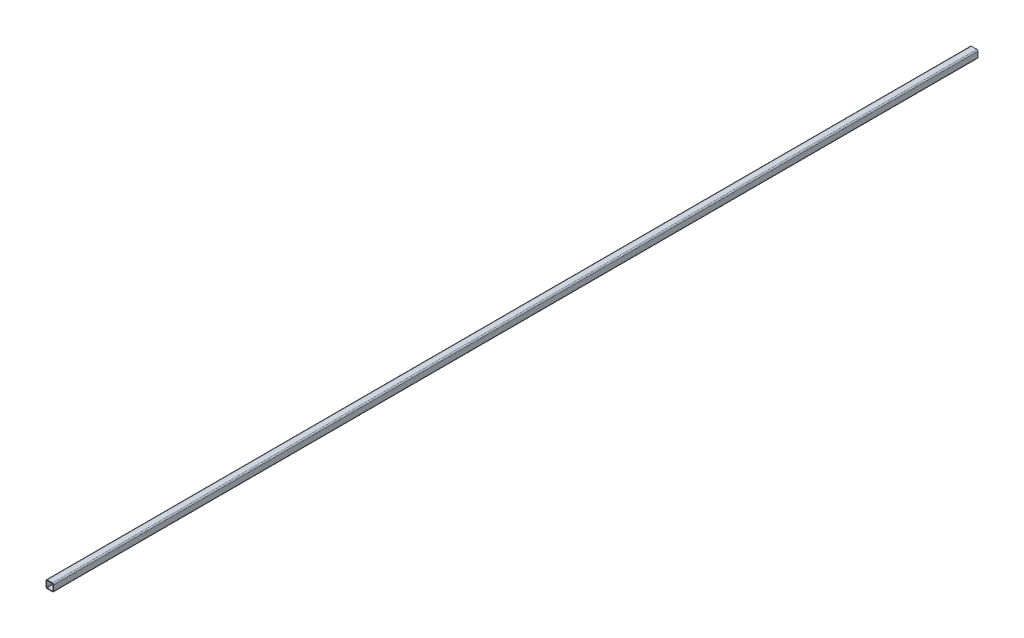
ISO-10303-21;
HEADER;
FILE_DESCRIPTION(('STEP AP214'),'2;1');
FILE_NAME('part.step','',(''),(''),'','','');
FILE_SCHEMA(('AUTOMOTIVE_DESIGN { 1 0 10303 214 1 1 1 1 }'));
ENDSEC;
DATA;
#1=APPLICATION_CONTEXT('core data for automotive mechanical design processes');
#2=APPLICATION_PROTOCOL_DEFINITION('international standard','automotive_design',2000,#1);
#3=PRODUCT_CONTEXT('',#1,'mechanical');
#4=PRODUCT('Part','Part','',(#3));
#5=PRODUCT_RELATED_PRODUCT_CATEGORY('part','',(#4));
#6=PRODUCT_DEFINITION_FORMATION('','',#4);
#7=PRODUCT_DEFINITION_CONTEXT('part definition',#1,'design');
#8=PRODUCT_DEFINITION('design','',#6,#7);
#9=PRODUCT_DEFINITION_SHAPE('','',#8);
#10=(LENGTH_UNIT() NAMED_UNIT(*) SI_UNIT(.MILLI.,.METRE.));
#11=(NAMED_UNIT(*) PLANE_ANGLE_UNIT() SI_UNIT($,.RADIAN.));
#12=(NAMED_UNIT(*) SI_UNIT($,.STERADIAN.) SOLID_ANGLE_UNIT());
#13=UNCERTAINTY_MEASURE_WITH_UNIT(LENGTH_MEASURE(1.E-05),#10,'distance_accuracy_value','');
#14=(GEOMETRIC_REPRESENTATION_CONTEXT(3) GLOBAL_UNCERTAINTY_ASSIGNED_CONTEXT((#13)) GLOBAL_UNIT_ASSIGNED_CONTEXT((#10,
#11,#12)) REPRESENTATION_CONTEXT('',''));
#15=CARTESIAN_POINT('',(0.,0.,0.));
#16=DIRECTION('',(0.,0.,1.));
#17=DIRECTION('',(1.,0.,0.));
#18=AXIS2_PLACEMENT_3D('',#15,#16,#17);
#19=CARTESIAN_POINT('',(0.999999329581613,-8.70000000652501,1524.));
#20=DIRECTION('',(0.,0.,1.));
#21=DIRECTION('',(1.,0.,0.));
#22=AXIS2_PLACEMENT_3D('',#19,#20,#21);
#23=PLANE('',#22);
#24=CARTESIAN_POINT('',(0.999999329581613,-8.70000000652501,1524.));
#25=DIRECTION('',(0.,0.,1.));
#26=DIRECTION('',(1.,0.,0.));
#27=AXIS2_PLACEMENT_3D('',#24,#25,#26);
#28=CIRCLE('',#27,2.);
#29=CARTESIAN_POINT('',(-1.00000067041839,-8.70000000652501,1524.));
#30=VERTEX_POINT('',#29);
#31=CARTESIAN_POINT('',(0.999999329581614,-10.700000006525,1524.));
#32=VERTEX_POINT('',#31);
#33=EDGE_CURVE('E282',#30,#32,#28,.T.);
#34=ORIENTED_EDGE('',*,*,#33,.T.);
#35=DIRECTION('',(1.,0.,0.));
#36=VECTOR('',#35,1.);
#37=CARTESIAN_POINT('',(0.999999329581614,-10.700000006525,1524.));
#38=LINE('',#37,#36);
#39=CARTESIAN_POINT('',(9.69999932958162,-10.700000006525,1524.));
#40=VERTEX_POINT('',#39);
#41=EDGE_CURVE('E286',#32,#40,#38,.T.);
#42=ORIENTED_EDGE('',*,*,#41,.T.);
#43=CARTESIAN_POINT('',(9.69999932958162,-8.700000006525,1524.));
#44=DIRECTION('',(0.,0.,1.));
#45=DIRECTION('',(1.,0.,0.));
#46=AXIS2_PLACEMENT_3D('',#43,#44,#45);
#47=CIRCLE('',#46,2.);
#48=CARTESIAN_POINT('',(11.6999993295816,-8.700000006525,1524.));
#49=VERTEX_POINT('',#48);
#50=EDGE_CURVE('E290',#40,#49,#47,.T.);
#51=ORIENTED_EDGE('',*,*,#50,.T.);
#52=DIRECTION('',(0.,1.,0.));
#53=VECTOR('',#52,1.);
#54=CARTESIAN_POINT('',(11.6999993295816,0.,1524.));
#55=LINE('',#54,#53);
#56=CARTESIAN_POINT('',(11.6999993295816,0.,1524.));
#57=VERTEX_POINT('',#56);
#58=EDGE_CURVE('E293',#49,#57,#55,.T.);
#59=ORIENTED_EDGE('',*,*,#58,.T.);
#60=CARTESIAN_POINT('',(9.69999932958161,0.,1524.));
#61=DIRECTION('',(0.,0.,1.));
#62=DIRECTION('',(1.,0.,0.));
#63=AXIS2_PLACEMENT_3D('',#60,#61,#62);
#64=CIRCLE('',#63,2.);
#65=CARTESIAN_POINT('',(9.69999932958161,2.,1524.));
#66=VERTEX_POINT('',#65);
#67=EDGE_CURVE('E296',#57,#66,#64,.T.);
#68=ORIENTED_EDGE('',*,*,#67,.T.);
#69=DIRECTION('',(-1.,0.,0.));
#70=VECTOR('',#69,1.);
#71=CARTESIAN_POINT('',(0.999999329581612,1.99999999999999,1524.));
#72=LINE('',#71,#70);
#73=CARTESIAN_POINT('',(0.999999329581612,1.99999999999999,1524.));
#74=VERTEX_POINT('',#73);
#75=EDGE_CURVE('E299',#66,#74,#72,.T.);
#76=ORIENTED_EDGE('',*,*,#75,.T.);
#77=CARTESIAN_POINT('',(0.999999329581613,0.,1524.));
#78=DIRECTION('',(0.,0.,1.));
#79=DIRECTION('',(1.,0.,0.));
#80=AXIS2_PLACEMENT_3D('',#77,#78,#79);
#81=CIRCLE('',#80,2.);
#82=CARTESIAN_POINT('',(-1.00000067041839,0.,1524.));
#83=VERTEX_POINT('',#82);
#84=EDGE_CURVE('E302',#74,#83,#81,.T.);
#85=ORIENTED_EDGE('',*,*,#84,.T.);
#86=DIRECTION('',(0.,-1.,0.));
#87=VECTOR('',#86,1.);
#88=CARTESIAN_POINT('',(-1.00000067041839,0.,1524.));
#89=LINE('',#88,#87);
#90=EDGE_CURVE('E305',#83,#30,#89,.T.);
#91=ORIENTED_EDGE('',*,*,#90,.T.);
#92=EDGE_LOOP('',(#34,#42,#51,#59,#68,#76,#85,#91));
#93=FACE_BOUND('',#92,.T.);
#94=DIRECTION('',(0.,-1.,0.));
#95=VECTOR('',#94,1.);
#96=CARTESIAN_POINT('',(0.,0.,1524.));
#97=LINE('',#96,#95);
#98=CARTESIAN_POINT('',(0.,0.,1524.));
#99=VERTEX_POINT('',#98);
#100=CARTESIAN_POINT('',(0.,-8.70000000652501,1524.));
#101=VERTEX_POINT('',#100);
#102=EDGE_CURVE('E201',#99,#101,#97,.T.);
#103=ORIENTED_EDGE('',*,*,#102,.F.);
#104=CARTESIAN_POINT('',(1.,0.,1524.));
#105=DIRECTION('',(0.,0.,1.));
#106=DIRECTION('',(1.,0.,0.));
#107=AXIS2_PLACEMENT_3D('',#104,#105,#106);
#108=CIRCLE('',#107,1.);
#109=CARTESIAN_POINT('',(1.,1.,1524.));
#110=VERTEX_POINT('',#109);
#111=EDGE_CURVE('E192',#110,#99,#108,.T.);
#112=ORIENTED_EDGE('',*,*,#111,.F.);
#113=DIRECTION('',(-1.,0.,0.));
#114=VECTOR('',#113,1.);
#115=CARTESIAN_POINT('',(9.69999932958162,1.,1524.));
#116=LINE('',#115,#114);
#117=CARTESIAN_POINT('',(9.69999932958162,1.,1524.));
#118=VERTEX_POINT('',#117);
#119=EDGE_CURVE('E234',#118,#110,#116,.T.);
#120=ORIENTED_EDGE('',*,*,#119,.F.);
#121=CARTESIAN_POINT('',(9.69999932958162,0.,1524.));
#122=DIRECTION('',(0.,0.,1.));
#123=DIRECTION('',(1.,0.,0.));
#124=AXIS2_PLACEMENT_3D('',#121,#122,#123);
#125=CIRCLE('',#124,1.);
#126=CARTESIAN_POINT('',(10.6999993295816,0.,1524.));
#127=VERTEX_POINT('',#126);
#128=EDGE_CURVE('E231',#127,#118,#125,.T.);
#129=ORIENTED_EDGE('',*,*,#128,.F.);
#130=DIRECTION('',(0.,1.,0.));
#131=VECTOR('',#130,1.);
#132=CARTESIAN_POINT('',(10.6999993295816,0.,1524.));
#133=LINE('',#132,#131);
#134=CARTESIAN_POINT('',(10.6999993295816,-8.70000000652501,1524.));
#135=VERTEX_POINT('',#134);
#136=EDGE_CURVE('E228',#135,#127,#133,.T.);
#137=ORIENTED_EDGE('',*,*,#136,.F.);
#138=CARTESIAN_POINT('',(9.69999932958162,-8.70000000652501,1524.));
#139=DIRECTION('',(0.,0.,1.));
#140=DIRECTION('',(1.,0.,0.));
#141=AXIS2_PLACEMENT_3D('',#138,#139,#140);
#142=CIRCLE('',#141,1.);
#143=CARTESIAN_POINT('',(9.69999932958162,-9.70000000652501,1524.));
#144=VERTEX_POINT('',#143);
#145=EDGE_CURVE('E225',#144,#135,#142,.T.);
#146=ORIENTED_EDGE('',*,*,#145,.F.);
#147=DIRECTION('',(1.,0.,0.));
#148=VECTOR('',#147,1.);
#149=CARTESIAN_POINT('',(9.69999932958162,-9.70000000652501,1524.));
#150=LINE('',#149,#148);
#151=CARTESIAN_POINT('',(1.,-9.70000000652501,1524.));
#152=VERTEX_POINT('',#151);
#153=EDGE_CURVE('E220',#152,#144,#150,.T.);
#154=ORIENTED_EDGE('',*,*,#153,.F.);
#155=CARTESIAN_POINT('',(1.,-8.70000000652501,1524.));
#156=DIRECTION('',(0.,0.,1.));
#157=DIRECTION('',(1.,0.,0.));
#158=AXIS2_PLACEMENT_3D('',#155,#156,#157);
#159=CIRCLE('',#158,1.);
#160=EDGE_CURVE('E215',#101,#152,#159,.T.);
#161=ORIENTED_EDGE('',*,*,#160,.F.);
#162=EDGE_LOOP('',(#103,#112,#120,#129,#137,#146,#154,#161));
#163=FACE_BOUND('',#162,.T.);
#164=ADVANCED_FACE('F46',(#93,#163),#23,.T.);
#165=CARTESIAN_POINT('',(0.999999329581613,-8.70000000652501,0.));
#166=DIRECTION('',(0.,0.,1.));
#167=DIRECTION('',(1.,0.,0.));
#168=AXIS2_PLACEMENT_3D('',#165,#166,#167);
#169=PLANE('',#168);
#170=CARTESIAN_POINT('',(0.999999329581613,-8.70000000652501,0.));
#171=DIRECTION('',(0.,0.,1.));
#172=DIRECTION('',(1.,0.,0.));
#173=AXIS2_PLACEMENT_3D('',#170,#171,#172);
#174=CIRCLE('',#173,2.);
#175=CARTESIAN_POINT('',(-1.00000067041839,-8.70000000652501,0.));
#176=VERTEX_POINT('',#175);
#177=CARTESIAN_POINT('',(0.999999329581614,-10.700000006525,0.));
#178=VERTEX_POINT('',#177);
#179=EDGE_CURVE('E210',#176,#178,#174,.T.);
#180=ORIENTED_EDGE('',*,*,#179,.F.);
#181=DIRECTION('',(0.,-1.,0.));
#182=VECTOR('',#181,1.);
#183=CARTESIAN_POINT('',(-1.00000067041839,0.,0.));
#184=LINE('',#183,#182);
#185=CARTESIAN_POINT('',(-1.00000067041839,0.,0.));
#186=VERTEX_POINT('',#185);
#187=EDGE_CURVE('E287',#186,#176,#184,.T.);
#188=ORIENTED_EDGE('',*,*,#187,.F.);
#189=CARTESIAN_POINT('',(0.999999329581613,0.,0.));
#190=DIRECTION('',(0.,0.,1.));
#191=DIRECTION('',(1.,0.,0.));
#192=AXIS2_PLACEMENT_3D('',#189,#190,#191);
#193=CIRCLE('',#192,2.);
#194=CARTESIAN_POINT('',(0.999999329581612,1.99999999999999,0.));
#195=VERTEX_POINT('',#194);
#196=EDGE_CURVE('E326',#195,#186,#193,.T.);
#197=ORIENTED_EDGE('',*,*,#196,.F.);
#198=DIRECTION('',(-1.,0.,0.));
#199=VECTOR('',#198,1.);
#200=CARTESIAN_POINT('',(0.999999329581612,1.99999999999999,0.));
#201=LINE('',#200,#199);
#202=CARTESIAN_POINT('',(9.69999932958161,2.,0.));
#203=VERTEX_POINT('',#202);
#204=EDGE_CURVE('E323',#203,#195,#201,.T.);
#205=ORIENTED_EDGE('',*,*,#204,.F.);
#206=CARTESIAN_POINT('',(9.69999932958161,0.,0.));
#207=DIRECTION('',(0.,0.,1.));
#208=DIRECTION('',(1.,0.,0.));
#209=AXIS2_PLACEMENT_3D('',#206,#207,#208);
#210=CIRCLE('',#209,2.);
#211=CARTESIAN_POINT('',(11.6999993295816,0.,0.));
#212=VERTEX_POINT('',#211);
#213=EDGE_CURVE('E320',#212,#203,#210,.T.);
#214=ORIENTED_EDGE('',*,*,#213,.F.);
#215=DIRECTION('',(0.,1.,0.));
#216=VECTOR('',#215,1.);
#217=CARTESIAN_POINT('',(11.6999993295816,0.,0.));
#218=LINE('',#217,#216);
#219=CARTESIAN_POINT('',(11.6999993295816,-8.700000006525,0.));
#220=VERTEX_POINT('',#219);
#221=EDGE_CURVE('E317',#220,#212,#218,.T.);
#222=ORIENTED_EDGE('',*,*,#221,.F.);
#223=CARTESIAN_POINT('',(9.69999932958162,-8.700000006525,0.));
#224=DIRECTION('',(0.,0.,1.));
#225=DIRECTION('',(1.,0.,0.));
#226=AXIS2_PLACEMENT_3D('',#223,#224,#225);
#227=CIRCLE('',#226,2.);
#228=CARTESIAN_POINT('',(9.69999932958162,-10.700000006525,0.));
#229=VERTEX_POINT('',#228);
#230=EDGE_CURVE('E314',#229,#220,#227,.T.);
#231=ORIENTED_EDGE('',*,*,#230,.F.);
#232=DIRECTION('',(1.,0.,0.));
#233=VECTOR('',#232,1.);
#234=CARTESIAN_POINT('',(0.999999329581614,-10.700000006525,0.));
#235=LINE('',#234,#233);
#236=EDGE_CURVE('E311',#178,#229,#235,.T.);
#237=ORIENTED_EDGE('',*,*,#236,.F.);
#238=EDGE_LOOP('',(#180,#188,#197,#205,#214,#222,#231,#237));
#239=FACE_BOUND('',#238,.T.);
#240=CARTESIAN_POINT('',(1.,0.,0.));
#241=DIRECTION('',(0.,0.,1.));
#242=DIRECTION('',(1.,0.,0.));
#243=AXIS2_PLACEMENT_3D('',#240,#241,#242);
#244=CIRCLE('',#243,1.);
#245=CARTESIAN_POINT('',(1.,0.999999999999999,0.));
#246=VERTEX_POINT('',#245);
#247=CARTESIAN_POINT('',(0.,0.,0.));
#248=VERTEX_POINT('',#247);
#249=EDGE_CURVE('E76',#246,#248,#244,.T.);
#250=ORIENTED_EDGE('',*,*,#249,.T.);
#251=DIRECTION('',(0.,-1.,0.));
#252=VECTOR('',#251,1.);
#253=CARTESIAN_POINT('',(0.,0.,0.));
#254=LINE('',#253,#252);
#255=CARTESIAN_POINT('',(0.,-8.70000000652501,0.));
#256=VERTEX_POINT('',#255);
#257=EDGE_CURVE('E208',#248,#256,#254,.T.);
#258=ORIENTED_EDGE('',*,*,#257,.T.);
#259=CARTESIAN_POINT('',(1.,-8.70000000652501,0.));
#260=DIRECTION('',(0.,0.,1.));
#261=DIRECTION('',(1.,0.,0.));
#262=AXIS2_PLACEMENT_3D('',#259,#260,#261);
#263=CIRCLE('',#262,1.);
#264=CARTESIAN_POINT('',(1.,-9.70000000652501,0.));
#265=VERTEX_POINT('',#264);
#266=EDGE_CURVE('E241',#256,#265,#263,.T.);
#267=ORIENTED_EDGE('',*,*,#266,.T.);
#268=DIRECTION('',(1.,0.,0.));
#269=VECTOR('',#268,1.);
#270=CARTESIAN_POINT('',(9.69999932958162,-9.70000000652501,0.));
#271=LINE('',#270,#269);
#272=CARTESIAN_POINT('',(9.69999932958162,-9.70000000652501,0.));
#273=VERTEX_POINT('',#272);
#274=EDGE_CURVE('E245',#265,#273,#271,.T.);
#275=ORIENTED_EDGE('',*,*,#274,.T.);
#276=CARTESIAN_POINT('',(9.69999932958162,-8.70000000652501,0.));
#277=DIRECTION('',(0.,0.,1.));
#278=DIRECTION('',(1.,0.,0.));
#279=AXIS2_PLACEMENT_3D('',#276,#277,#278);
#280=CIRCLE('',#279,1.);
#281=CARTESIAN_POINT('',(10.6999993295816,-8.70000000652501,0.));
#282=VERTEX_POINT('',#281);
#283=EDGE_CURVE('E249',#273,#282,#280,.T.);
#284=ORIENTED_EDGE('',*,*,#283,.T.);
#285=DIRECTION('',(0.,1.,0.));
#286=VECTOR('',#285,1.);
#287=CARTESIAN_POINT('',(10.6999993295816,0.,0.));
#288=LINE('',#287,#286);
#289=CARTESIAN_POINT('',(10.6999993295816,0.,0.));
#290=VERTEX_POINT('',#289);
#291=EDGE_CURVE('E253',#282,#290,#288,.T.);
#292=ORIENTED_EDGE('',*,*,#291,.T.);
#293=CARTESIAN_POINT('',(9.69999932958162,0.,0.));
#294=DIRECTION('',(0.,0.,1.));
#295=DIRECTION('',(1.,0.,0.));
#296=AXIS2_PLACEMENT_3D('',#293,#294,#295);
#297=CIRCLE('',#296,1.);
#298=CARTESIAN_POINT('',(9.69999932958162,1.,0.));
#299=VERTEX_POINT('',#298);
#300=EDGE_CURVE('E257',#290,#299,#297,.T.);
#301=ORIENTED_EDGE('',*,*,#300,.T.);
#302=DIRECTION('',(-1.,0.,0.));
#303=VECTOR('',#302,1.);
#304=CARTESIAN_POINT('',(9.69999932958162,1.,0.));
#305=LINE('',#304,#303);
#306=EDGE_CURVE('E202',#299,#246,#305,.T.);
#307=ORIENTED_EDGE('',*,*,#306,.T.);
#308=EDGE_LOOP('',(#250,#258,#267,#275,#284,#292,#301,#307));
#309=FACE_BOUND('',#308,.T.);
#310=ADVANCED_FACE('F365',(#239,#309),#169,.F.);
#311=CARTESIAN_POINT('',(0.999999329581613,-8.70000000652501,1524.));
#312=DIRECTION('',(0.,0.,-1.));
#313=DIRECTION('',(-1.,0.,0.));
#314=AXIS2_PLACEMENT_3D('',#311,#312,#313);
#315=CYLINDRICAL_SURFACE('',#314,2.);
#316=ORIENTED_EDGE('',*,*,#179,.T.);
#317=DIRECTION('',(0.,0.,-1.));
#318=VECTOR('',#317,1.);
#319=CARTESIAN_POINT('',(0.999999329581614,-10.700000006525,1524.));
#320=LINE('',#319,#318);
#321=EDGE_CURVE('E11',#32,#178,#320,.T.);
#322=ORIENTED_EDGE('',*,*,#321,.F.);
#323=ORIENTED_EDGE('',*,*,#33,.F.);
#324=DIRECTION('',(0.,0.,-1.));
#325=VECTOR('',#324,1.);
#326=CARTESIAN_POINT('',(-1.00000067041839,-8.70000000652501,1524.));
#327=LINE('',#326,#325);
#328=EDGE_CURVE('E307',#30,#176,#327,.T.);
#329=ORIENTED_EDGE('',*,*,#328,.T.);
#330=EDGE_LOOP('',(#316,#322,#323,#329));
#331=FACE_BOUND('',#330,.T.);
#332=ADVANCED_FACE('F48',(#331),#315,.T.);
#333=CARTESIAN_POINT('',(0.999999329581614,-10.700000006525,1524.));
#334=DIRECTION('',(0.,1.,0.));
#335=DIRECTION('',(0.,0.,1.));
#336=AXIS2_PLACEMENT_3D('',#333,#334,#335);
#337=PLANE('',#336);
#338=ORIENTED_EDGE('',*,*,#236,.T.);
#339=DIRECTION('',(0.,0.,-1.));
#340=VECTOR('',#339,1.);
#341=CARTESIAN_POINT('',(9.69999932958162,-10.700000006525,1524.));
#342=LINE('',#341,#340);
#343=EDGE_CURVE('E55',#40,#229,#342,.T.);
#344=ORIENTED_EDGE('',*,*,#343,.F.);
#345=ORIENTED_EDGE('',*,*,#41,.F.);
#346=ORIENTED_EDGE('',*,*,#321,.T.);
#347=EDGE_LOOP('',(#338,#344,#345,#346));
#348=FACE_BOUND('',#347,.T.);
#349=ADVANCED_FACE('F382',(#348),#337,.F.);
#350=CARTESIAN_POINT('',(9.69999932958162,-8.700000006525,1524.));
#351=DIRECTION('',(0.,0.,-1.));
#352=DIRECTION('',(-1.,0.,0.));
#353=AXIS2_PLACEMENT_3D('',#350,#351,#352);
#354=CYLINDRICAL_SURFACE('',#353,2.);
#355=ORIENTED_EDGE('',*,*,#230,.T.);
#356=DIRECTION('',(0.,0.,-1.));
#357=VECTOR('',#356,1.);
#358=CARTESIAN_POINT('',(11.6999993295816,-8.700000006525,1524.));
#359=LINE('',#358,#357);
#360=EDGE_CURVE('E350',#49,#220,#359,.T.);
#361=ORIENTED_EDGE('',*,*,#360,.F.);
#362=ORIENTED_EDGE('',*,*,#50,.F.);
#363=ORIENTED_EDGE('',*,*,#343,.T.);
#364=EDGE_LOOP('',(#355,#361,#362,#363));
#365=FACE_BOUND('',#364,.T.);
#366=ADVANCED_FACE('F359',(#365),#354,.T.);
#367=CARTESIAN_POINT('',(11.6999993295816,0.,1524.));
#368=DIRECTION('',(-1.,0.,0.));
#369=DIRECTION('',(0.,-1.,0.));
#370=AXIS2_PLACEMENT_3D('',#367,#368,#369);
#371=PLANE('',#370);
#372=ORIENTED_EDGE('',*,*,#221,.T.);
#373=DIRECTION('',(0.,0.,-1.));
#374=VECTOR('',#373,1.);
#375=CARTESIAN_POINT('',(11.6999993295816,0.,1524.));
#376=LINE('',#375,#374);
#377=EDGE_CURVE('E346',#57,#212,#376,.T.);
#378=ORIENTED_EDGE('',*,*,#377,.F.);
#379=ORIENTED_EDGE('',*,*,#58,.F.);
#380=ORIENTED_EDGE('',*,*,#360,.T.);
#381=EDGE_LOOP('',(#372,#378,#379,#380));
#382=FACE_BOUND('',#381,.T.);
#383=ADVANCED_FACE('F371',(#382),#371,.F.);
#384=CARTESIAN_POINT('',(9.69999932958161,0.,1524.));
#385=DIRECTION('',(0.,0.,-1.));
#386=DIRECTION('',(-1.,0.,0.));
#387=AXIS2_PLACEMENT_3D('',#384,#385,#386);
#388=CYLINDRICAL_SURFACE('',#387,2.);
#389=ORIENTED_EDGE('',*,*,#213,.T.);
#390=DIRECTION('',(0.,0.,-1.));
#391=VECTOR('',#390,1.);
#392=CARTESIAN_POINT('',(9.69999932958161,2.,1524.));
#393=LINE('',#392,#391);
#394=EDGE_CURVE('E342',#66,#203,#393,.T.);
#395=ORIENTED_EDGE('',*,*,#394,.F.);
#396=ORIENTED_EDGE('',*,*,#67,.F.);
#397=ORIENTED_EDGE('',*,*,#377,.T.);
#398=EDGE_LOOP('',(#389,#395,#396,#397));
#399=FACE_BOUND('',#398,.T.);
#400=ADVANCED_FACE('F375',(#399),#388,.T.);
#401=CARTESIAN_POINT('',(0.999999329581612,1.99999999999999,1524.));
#402=DIRECTION('',(0.,-1.,0.));
#403=DIRECTION('',(1.,0.,0.));
#404=AXIS2_PLACEMENT_3D('',#401,#402,#403);
#405=PLANE('',#404);
#406=ORIENTED_EDGE('',*,*,#204,.T.);
#407=DIRECTION('',(0.,0.,-1.));
#408=VECTOR('',#407,1.);
#409=CARTESIAN_POINT('',(0.999999329581612,1.99999999999999,1524.));
#410=LINE('',#409,#408);
#411=EDGE_CURVE('E338',#74,#195,#410,.T.);
#412=ORIENTED_EDGE('',*,*,#411,.F.);
#413=ORIENTED_EDGE('',*,*,#75,.F.);
#414=ORIENTED_EDGE('',*,*,#394,.T.);
#415=EDGE_LOOP('',(#406,#412,#413,#414));
#416=FACE_BOUND('',#415,.T.);
#417=ADVANCED_FACE('F395',(#416),#405,.F.);
#418=CARTESIAN_POINT('',(0.999999329581613,0.,1524.));
#419=DIRECTION('',(0.,0.,-1.));
#420=DIRECTION('',(-1.,0.,0.));
#421=AXIS2_PLACEMENT_3D('',#418,#419,#420);
#422=CYLINDRICAL_SURFACE('',#421,2.);
#423=ORIENTED_EDGE('',*,*,#196,.T.);
#424=DIRECTION('',(0.,0.,-1.));
#425=VECTOR('',#424,1.);
#426=CARTESIAN_POINT('',(-1.00000067041839,0.,1524.));
#427=LINE('',#426,#425);
#428=EDGE_CURVE('E334',#83,#186,#427,.T.);
#429=ORIENTED_EDGE('',*,*,#428,.F.);
#430=ORIENTED_EDGE('',*,*,#84,.F.);
#431=ORIENTED_EDGE('',*,*,#411,.T.);
#432=EDGE_LOOP('',(#423,#429,#430,#431));
#433=FACE_BOUND('',#432,.T.);
#434=ADVANCED_FACE('F393',(#433),#422,.T.);
#435=CARTESIAN_POINT('',(-1.00000067041839,0.,1524.));
#436=DIRECTION('',(1.,0.,0.));
#437=DIRECTION('',(0.,1.,0.));
#438=AXIS2_PLACEMENT_3D('',#435,#436,#437);
#439=PLANE('',#438);
#440=ORIENTED_EDGE('',*,*,#187,.T.);
#441=ORIENTED_EDGE('',*,*,#328,.F.);
#442=ORIENTED_EDGE('',*,*,#90,.F.);
#443=ORIENTED_EDGE('',*,*,#428,.T.);
#444=EDGE_LOOP('',(#440,#441,#442,#443));
#445=FACE_BOUND('',#444,.T.);
#446=ADVANCED_FACE('F388',(#445),#439,.F.);
#447=CARTESIAN_POINT('',(1.,0.,1524.));
#448=DIRECTION('',(0.,0.,-1.));
#449=DIRECTION('',(-1.,0.,0.));
#450=AXIS2_PLACEMENT_3D('',#447,#448,#449);
#451=CYLINDRICAL_SURFACE('',#450,1.);
#452=ORIENTED_EDGE('',*,*,#249,.F.);
#453=DIRECTION('',(0.,0.,-1.));
#454=VECTOR('',#453,1.);
#455=CARTESIAN_POINT('',(1.,1.,1524.));
#456=LINE('',#455,#454);
#457=EDGE_CURVE('E196',#110,#246,#456,.T.);
#458=ORIENTED_EDGE('',*,*,#457,.F.);
#459=ORIENTED_EDGE('',*,*,#111,.T.);
#460=DIRECTION('',(0.,0.,-1.));
#461=VECTOR('',#460,1.);
#462=CARTESIAN_POINT('',(0.,0.,1524.));
#463=LINE('',#462,#461);
#464=EDGE_CURVE('E195',#99,#248,#463,.T.);
#465=ORIENTED_EDGE('',*,*,#464,.T.);
#466=EDGE_LOOP('',(#452,#458,#459,#465));
#467=FACE_BOUND('',#466,.T.);
#468=ADVANCED_FACE('F194',(#467),#451,.F.);
#469=CARTESIAN_POINT('',(0.,0.,1524.));
#470=DIRECTION('',(1.,0.,0.));
#471=DIRECTION('',(0.,1.,0.));
#472=AXIS2_PLACEMENT_3D('',#469,#470,#471);
#473=PLANE('',#472);
#474=ORIENTED_EDGE('',*,*,#257,.F.);
#475=ORIENTED_EDGE('',*,*,#464,.F.);
#476=ORIENTED_EDGE('',*,*,#102,.T.);
#477=DIRECTION('',(0.,0.,-1.));
#478=VECTOR('',#477,1.);
#479=CARTESIAN_POINT('',(0.,-8.70000000652501,1524.));
#480=LINE('',#479,#478);
#481=EDGE_CURVE('E211',#101,#256,#480,.T.);
#482=ORIENTED_EDGE('',*,*,#481,.T.);
#483=EDGE_LOOP('',(#474,#475,#476,#482));
#484=FACE_BOUND('',#483,.T.);
#485=ADVANCED_FACE('F205',(#484),#473,.T.);
#486=CARTESIAN_POINT('',(1.,-8.70000000652501,1524.));
#487=DIRECTION('',(0.,0.,-1.));
#488=DIRECTION('',(-1.,0.,0.));
#489=AXIS2_PLACEMENT_3D('',#486,#487,#488);
#490=CYLINDRICAL_SURFACE('',#489,1.);
#491=ORIENTED_EDGE('',*,*,#266,.F.);
#492=ORIENTED_EDGE('',*,*,#481,.F.);
#493=ORIENTED_EDGE('',*,*,#160,.T.);
#494=DIRECTION('',(0.,0.,-1.));
#495=VECTOR('',#494,1.);
#496=CARTESIAN_POINT('',(1.,-9.70000000652501,1524.));
#497=LINE('',#496,#495);
#498=EDGE_CURVE('E277',#152,#265,#497,.T.);
#499=ORIENTED_EDGE('',*,*,#498,.T.);
#500=EDGE_LOOP('',(#491,#492,#493,#499));
#501=FACE_BOUND('',#500,.T.);
#502=ADVANCED_FACE('F420',(#501),#490,.F.);
#503=CARTESIAN_POINT('',(9.69999932958162,-9.70000000652501,1524.));
#504=DIRECTION('',(0.,1.,0.));
#505=DIRECTION('',(0.,0.,1.));
#506=AXIS2_PLACEMENT_3D('',#503,#504,#505);
#507=PLANE('',#506);
#508=ORIENTED_EDGE('',*,*,#274,.F.);
#509=ORIENTED_EDGE('',*,*,#498,.F.);
#510=ORIENTED_EDGE('',*,*,#153,.T.);
#511=DIRECTION('',(0.,0.,-1.));
#512=VECTOR('',#511,1.);
#513=CARTESIAN_POINT('',(9.69999932958162,-9.70000000652501,1524.));
#514=LINE('',#513,#512);
#515=EDGE_CURVE('E274',#144,#273,#514,.T.);
#516=ORIENTED_EDGE('',*,*,#515,.T.);
#517=EDGE_LOOP('',(#508,#509,#510,#516));
#518=FACE_BOUND('',#517,.T.);
#519=ADVANCED_FACE('F424',(#518),#507,.T.);
#520=CARTESIAN_POINT('',(9.69999932958162,-8.70000000652501,1524.));
#521=DIRECTION('',(0.,0.,-1.));
#522=DIRECTION('',(-1.,0.,0.));
#523=AXIS2_PLACEMENT_3D('',#520,#521,#522);
#524=CYLINDRICAL_SURFACE('',#523,1.);
#525=ORIENTED_EDGE('',*,*,#283,.F.);
#526=ORIENTED_EDGE('',*,*,#515,.F.);
#527=ORIENTED_EDGE('',*,*,#145,.T.);
#528=DIRECTION('',(0.,0.,-1.));
#529=VECTOR('',#528,1.);
#530=CARTESIAN_POINT('',(10.6999993295816,-8.70000000652501,1524.));
#531=LINE('',#530,#529);
#532=EDGE_CURVE('E271',#135,#282,#531,.T.);
#533=ORIENTED_EDGE('',*,*,#532,.T.);
#534=EDGE_LOOP('',(#525,#526,#527,#533));
#535=FACE_BOUND('',#534,.T.);
#536=ADVANCED_FACE('F429',(#535),#524,.F.);
#537=CARTESIAN_POINT('',(10.6999993295816,0.,1524.));
#538=DIRECTION('',(-1.,0.,0.));
#539=DIRECTION('',(0.,-1.,0.));
#540=AXIS2_PLACEMENT_3D('',#537,#538,#539);
#541=PLANE('',#540);
#542=ORIENTED_EDGE('',*,*,#291,.F.);
#543=ORIENTED_EDGE('',*,*,#532,.F.);
#544=ORIENTED_EDGE('',*,*,#136,.T.);
#545=DIRECTION('',(0.,0.,-1.));
#546=VECTOR('',#545,1.);
#547=CARTESIAN_POINT('',(10.6999993295816,0.,1524.));
#548=LINE('',#547,#546);
#549=EDGE_CURVE('E268',#127,#290,#548,.T.);
#550=ORIENTED_EDGE('',*,*,#549,.T.);
#551=EDGE_LOOP('',(#542,#543,#544,#550));
#552=FACE_BOUND('',#551,.T.);
#553=ADVANCED_FACE('F433',(#552),#541,.T.);
#554=CARTESIAN_POINT('',(9.69999932958162,0.,1524.));
#555=DIRECTION('',(0.,0.,-1.));
#556=DIRECTION('',(-1.,0.,0.));
#557=AXIS2_PLACEMENT_3D('',#554,#555,#556);
#558=CYLINDRICAL_SURFACE('',#557,1.);
#559=ORIENTED_EDGE('',*,*,#300,.F.);
#560=ORIENTED_EDGE('',*,*,#549,.F.);
#561=ORIENTED_EDGE('',*,*,#128,.T.);
#562=DIRECTION('',(0.,0.,-1.));
#563=VECTOR('',#562,1.);
#564=CARTESIAN_POINT('',(9.69999932958162,1.,1524.));
#565=LINE('',#564,#563);
#566=EDGE_CURVE('E65',#118,#299,#565,.T.);
#567=ORIENTED_EDGE('',*,*,#566,.T.);
#568=EDGE_LOOP('',(#559,#560,#561,#567));
#569=FACE_BOUND('',#568,.T.);
#570=ADVANCED_FACE('F437',(#569),#558,.F.);
#571=CARTESIAN_POINT('',(9.69999932958162,1.,1524.));
#572=DIRECTION('',(0.,-1.,0.));
#573=DIRECTION('',(1.,0.,0.));
#574=AXIS2_PLACEMENT_3D('',#571,#572,#573);
#575=PLANE('',#574);
#576=ORIENTED_EDGE('',*,*,#306,.F.);
#577=ORIENTED_EDGE('',*,*,#566,.F.);
#578=ORIENTED_EDGE('',*,*,#119,.T.);
#579=ORIENTED_EDGE('',*,*,#457,.T.);
#580=EDGE_LOOP('',(#576,#577,#578,#579));
#581=FACE_BOUND('',#580,.T.);
#582=ADVANCED_FACE('F441',(#581),#575,.T.);
#583=CLOSED_SHELL('',(#164,#310,#332,#349,#366,#383,#400,#417,#434,#446,#468,#485,#502,#519,
#536,#553,#570,#582));
#584=MANIFOLD_SOLID_BREP('B2',#583);
#585=ADVANCED_BREP_SHAPE_REPRESENTATION('',(#18,#584),#14);
#586=SHAPE_DEFINITION_REPRESENTATION(#9,#585);
ENDSEC;
END-ISO-10303-21;
